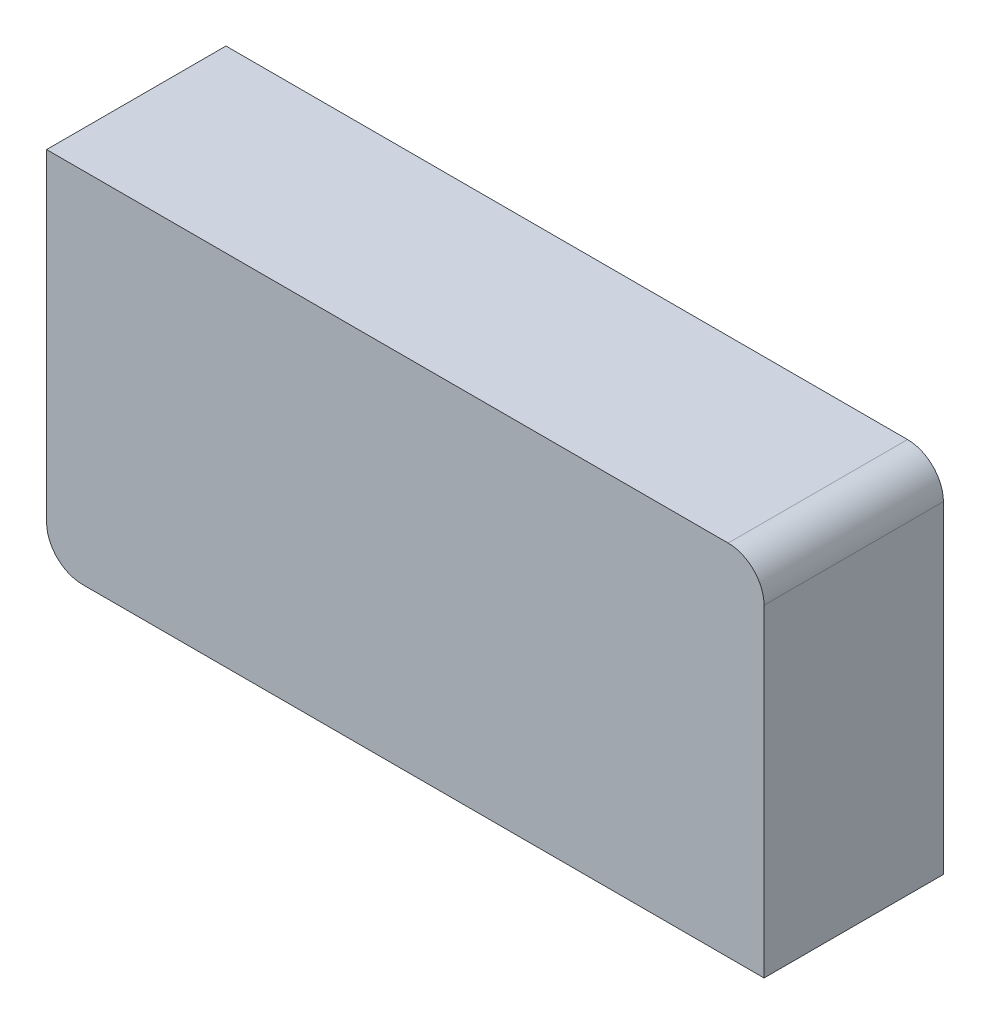
ISO-10303-21;
HEADER;
FILE_DESCRIPTION(('STEP AP214'),'2;1');
FILE_NAME('part.step','',(''),(''),'','','');
FILE_SCHEMA(('AUTOMOTIVE_DESIGN { 1 0 10303 214 1 1 1 1 }'));
ENDSEC;
DATA;
#1=APPLICATION_CONTEXT('core data for automotive mechanical design processes');
#2=APPLICATION_PROTOCOL_DEFINITION('international standard','automotive_design',2000,#1);
#3=PRODUCT_CONTEXT('',#1,'mechanical');
#4=PRODUCT('Part','Part','',(#3));
#5=PRODUCT_RELATED_PRODUCT_CATEGORY('part','',(#4));
#6=PRODUCT_DEFINITION_FORMATION('','',#4);
#7=PRODUCT_DEFINITION_CONTEXT('part definition',#1,'design');
#8=PRODUCT_DEFINITION('design','',#6,#7);
#9=PRODUCT_DEFINITION_SHAPE('','',#8);
#10=(LENGTH_UNIT() NAMED_UNIT(*) SI_UNIT(.MILLI.,.METRE.));
#11=(NAMED_UNIT(*) PLANE_ANGLE_UNIT() SI_UNIT($,.RADIAN.));
#12=(NAMED_UNIT(*) SI_UNIT($,.STERADIAN.) SOLID_ANGLE_UNIT());
#13=UNCERTAINTY_MEASURE_WITH_UNIT(LENGTH_MEASURE(1.E-05),#10,'distance_accuracy_value','');
#14=(GEOMETRIC_REPRESENTATION_CONTEXT(3) GLOBAL_UNCERTAINTY_ASSIGNED_CONTEXT((#13)) GLOBAL_UNIT_ASSIGNED_CONTEXT((#10,
#11,#12)) REPRESENTATION_CONTEXT('',''));
#15=CARTESIAN_POINT('',(0.,0.,0.));
#16=DIRECTION('',(0.,0.,1.));
#17=DIRECTION('',(1.,0.,0.));
#18=AXIS2_PLACEMENT_3D('',#15,#16,#17);
#19=CARTESIAN_POINT('',(0.,20.,10.));
#20=DIRECTION('',(1.,0.,0.));
#21=DIRECTION('',(0.,0.,-1.));
#22=AXIS2_PLACEMENT_3D('',#19,#20,#21);
#23=PLANE('',#22);
#24=DIRECTION('',(0.,-1.,0.));
#25=VECTOR('',#24,1.);
#26=CARTESIAN_POINT('',(0.,20.,0.));
#27=LINE('',#26,#25);
#28=CARTESIAN_POINT('',(0.,20.,0.));
#29=VERTEX_POINT('',#28);
#30=CARTESIAN_POINT('',(0.,2.,0.));
#31=VERTEX_POINT('',#30);
#32=EDGE_CURVE('E122',#29,#31,#27,.T.);
#33=ORIENTED_EDGE('',*,*,#32,.T.);
#34=DIRECTION('',(0.,0.,-1.));
#35=VECTOR('',#34,1.);
#36=CARTESIAN_POINT('',(0.,2.,10.));
#37=LINE('',#36,#35);
#38=CARTESIAN_POINT('',(0.,2.,10.));
#39=VERTEX_POINT('',#38);
#40=EDGE_CURVE('E11',#31,#39,#37,.F.);
#41=ORIENTED_EDGE('',*,*,#40,.T.);
#42=DIRECTION('',(0.,-1.,0.));
#43=VECTOR('',#42,1.);
#44=CARTESIAN_POINT('',(0.,20.,10.));
#45=LINE('',#44,#43);
#46=CARTESIAN_POINT('',(0.,20.,10.));
#47=VERTEX_POINT('',#46);
#48=EDGE_CURVE('E101',#47,#39,#45,.T.);
#49=ORIENTED_EDGE('',*,*,#48,.F.);
#50=DIRECTION('',(0.,0.,-1.));
#51=VECTOR('',#50,1.);
#52=CARTESIAN_POINT('',(0.,20.,10.));
#53=LINE('',#52,#51);
#54=EDGE_CURVE('E112',#47,#29,#53,.T.);
#55=ORIENTED_EDGE('',*,*,#54,.T.);
#56=EDGE_LOOP('',(#33,#41,#49,#55));
#57=FACE_BOUND('',#56,.T.);
#58=ADVANCED_FACE('F41',(#57),#23,.F.);
#59=CARTESIAN_POINT('',(0.,0.,10.));
#60=DIRECTION('',(0.,1.,0.));
#61=DIRECTION('',(0.,0.,1.));
#62=AXIS2_PLACEMENT_3D('',#59,#60,#61);
#63=PLANE('',#62);
#64=DIRECTION('',(1.,0.,0.));
#65=VECTOR('',#64,1.);
#66=CARTESIAN_POINT('',(0.,0.,10.));
#67=LINE('',#66,#65);
#68=CARTESIAN_POINT('',(2.,0.,10.));
#69=VERTEX_POINT('',#68);
#70=CARTESIAN_POINT('',(40.,0.,10.));
#71=VERTEX_POINT('',#70);
#72=EDGE_CURVE('E92',#69,#71,#67,.T.);
#73=ORIENTED_EDGE('',*,*,#72,.F.);
#74=DIRECTION('',(0.,0.,-1.));
#75=VECTOR('',#74,1.);
#76=CARTESIAN_POINT('',(2.,0.,10.));
#77=LINE('',#76,#75);
#78=CARTESIAN_POINT('',(2.,0.,0.));
#79=VERTEX_POINT('',#78);
#80=EDGE_CURVE('E49',#69,#79,#77,.T.);
#81=ORIENTED_EDGE('',*,*,#80,.T.);
#82=DIRECTION('',(1.,0.,0.));
#83=VECTOR('',#82,1.);
#84=CARTESIAN_POINT('',(0.,0.,0.));
#85=LINE('',#84,#83);
#86=CARTESIAN_POINT('',(40.,0.,0.));
#87=VERTEX_POINT('',#86);
#88=EDGE_CURVE('E107',#79,#87,#85,.T.);
#89=ORIENTED_EDGE('',*,*,#88,.T.);
#90=DIRECTION('',(0.,0.,-1.));
#91=VECTOR('',#90,1.);
#92=CARTESIAN_POINT('',(40.,0.,10.));
#93=LINE('',#92,#91);
#94=EDGE_CURVE('E104',#71,#87,#93,.T.);
#95=ORIENTED_EDGE('',*,*,#94,.F.);
#96=EDGE_LOOP('',(#73,#81,#89,#95));
#97=FACE_BOUND('',#96,.T.);
#98=ADVANCED_FACE('F105',(#97),#63,.F.);
#99=CARTESIAN_POINT('',(40.,0.,10.));
#100=DIRECTION('',(-1.,0.,0.));
#101=DIRECTION('',(0.,0.,1.));
#102=AXIS2_PLACEMENT_3D('',#99,#100,#101);
#103=PLANE('',#102);
#104=DIRECTION('',(0.,1.,0.));
#105=VECTOR('',#104,1.);
#106=CARTESIAN_POINT('',(40.,0.,0.));
#107=LINE('',#106,#105);
#108=CARTESIAN_POINT('',(40.,18.,0.));
#109=VERTEX_POINT('',#108);
#110=EDGE_CURVE('E125',#87,#109,#107,.T.);
#111=ORIENTED_EDGE('',*,*,#110,.T.);
#112=DIRECTION('',(0.,0.,-1.));
#113=VECTOR('',#112,1.);
#114=CARTESIAN_POINT('',(40.,18.,10.));
#115=LINE('',#114,#113);
#116=CARTESIAN_POINT('',(40.,18.,10.));
#117=VERTEX_POINT('',#116);
#118=EDGE_CURVE('E116',#109,#117,#115,.F.);
#119=ORIENTED_EDGE('',*,*,#118,.T.);
#120=DIRECTION('',(0.,1.,0.));
#121=VECTOR('',#120,1.);
#122=CARTESIAN_POINT('',(40.,0.,10.));
#123=LINE('',#122,#121);
#124=EDGE_CURVE('E96',#71,#117,#123,.T.);
#125=ORIENTED_EDGE('',*,*,#124,.F.);
#126=ORIENTED_EDGE('',*,*,#94,.T.);
#127=EDGE_LOOP('',(#111,#119,#125,#126));
#128=FACE_BOUND('',#127,.T.);
#129=ADVANCED_FACE('F114',(#128),#103,.F.);
#130=CARTESIAN_POINT('',(40.,20.,10.));
#131=DIRECTION('',(0.,-1.,0.));
#132=DIRECTION('',(0.,0.,-1.));
#133=AXIS2_PLACEMENT_3D('',#130,#131,#132);
#134=PLANE('',#133);
#135=DIRECTION('',(-1.,0.,0.));
#136=VECTOR('',#135,1.);
#137=CARTESIAN_POINT('',(40.,20.,10.));
#138=LINE('',#137,#136);
#139=CARTESIAN_POINT('',(38.,20.,10.));
#140=VERTEX_POINT('',#139);
#141=EDGE_CURVE('E117',#140,#47,#138,.T.);
#142=ORIENTED_EDGE('',*,*,#141,.F.);
#143=DIRECTION('',(0.,0.,-1.));
#144=VECTOR('',#143,1.);
#145=CARTESIAN_POINT('',(38.,20.,10.));
#146=LINE('',#145,#144);
#147=CARTESIAN_POINT('',(38.,20.,0.));
#148=VERTEX_POINT('',#147);
#149=EDGE_CURVE('E111',#140,#148,#146,.T.);
#150=ORIENTED_EDGE('',*,*,#149,.T.);
#151=DIRECTION('',(-1.,0.,0.));
#152=VECTOR('',#151,1.);
#153=CARTESIAN_POINT('',(40.,20.,0.));
#154=LINE('',#153,#152);
#155=EDGE_CURVE('E127',#148,#29,#154,.T.);
#156=ORIENTED_EDGE('',*,*,#155,.T.);
#157=ORIENTED_EDGE('',*,*,#54,.F.);
#158=EDGE_LOOP('',(#142,#150,#156,#157));
#159=FACE_BOUND('',#158,.T.);
#160=ADVANCED_FACE('F151',(#159),#134,.F.);
#161=CARTESIAN_POINT('',(0.,0.,10.));
#162=DIRECTION('',(0.,0.,1.));
#163=DIRECTION('',(1.,0.,0.));
#164=AXIS2_PLACEMENT_3D('',#161,#162,#163);
#165=PLANE('',#164);
#166=ORIENTED_EDGE('',*,*,#124,.T.);
#167=CARTESIAN_POINT('',(38.,18.,10.));
#168=DIRECTION('',(0.,0.,1.));
#169=DIRECTION('',(1.,0.,0.));
#170=AXIS2_PLACEMENT_3D('',#167,#168,#169);
#171=CIRCLE('',#170,2.);
#172=EDGE_CURVE('E139',#117,#140,#171,.T.);
#173=ORIENTED_EDGE('',*,*,#172,.T.);
#174=ORIENTED_EDGE('',*,*,#141,.T.);
#175=ORIENTED_EDGE('',*,*,#48,.T.);
#176=CARTESIAN_POINT('',(2.,2.,10.));
#177=DIRECTION('',(0.,0.,1.));
#178=DIRECTION('',(1.,0.,0.));
#179=AXIS2_PLACEMENT_3D('',#176,#177,#178);
#180=CIRCLE('',#179,2.);
#181=EDGE_CURVE('E56',#39,#69,#180,.T.);
#182=ORIENTED_EDGE('',*,*,#181,.T.);
#183=ORIENTED_EDGE('',*,*,#72,.T.);
#184=EDGE_LOOP('',(#166,#173,#174,#175,#182,#183));
#185=FACE_BOUND('',#184,.T.);
#186=ADVANCED_FACE('F94',(#185),#165,.T.);
#187=CARTESIAN_POINT('',(0.,0.,0.));
#188=DIRECTION('',(0.,0.,1.));
#189=DIRECTION('',(1.,0.,0.));
#190=AXIS2_PLACEMENT_3D('',#187,#188,#189);
#191=PLANE('',#190);
#192=ORIENTED_EDGE('',*,*,#155,.F.);
#193=CARTESIAN_POINT('',(38.,18.,0.));
#194=DIRECTION('',(0.,0.,1.));
#195=DIRECTION('',(1.,0.,0.));
#196=AXIS2_PLACEMENT_3D('',#193,#194,#195);
#197=CIRCLE('',#196,2.);
#198=EDGE_CURVE('E135',#148,#109,#197,.F.);
#199=ORIENTED_EDGE('',*,*,#198,.T.);
#200=ORIENTED_EDGE('',*,*,#110,.F.);
#201=ORIENTED_EDGE('',*,*,#88,.F.);
#202=CARTESIAN_POINT('',(2.,2.,0.));
#203=DIRECTION('',(0.,0.,1.));
#204=DIRECTION('',(1.,0.,0.));
#205=AXIS2_PLACEMENT_3D('',#202,#203,#204);
#206=CIRCLE('',#205,2.);
#207=EDGE_CURVE('E133',#79,#31,#206,.F.);
#208=ORIENTED_EDGE('',*,*,#207,.T.);
#209=ORIENTED_EDGE('',*,*,#32,.F.);
#210=EDGE_LOOP('',(#192,#199,#200,#201,#208,#209));
#211=FACE_BOUND('',#210,.T.);
#212=ADVANCED_FACE('F143',(#211),#191,.F.);
#213=CARTESIAN_POINT('',(38.,18.,10.));
#214=DIRECTION('',(0.,0.,-1.));
#215=DIRECTION('',(-1.,0.,0.));
#216=AXIS2_PLACEMENT_3D('',#213,#214,#215);
#217=CYLINDRICAL_SURFACE('',#216,2.);
#218=ORIENTED_EDGE('',*,*,#172,.F.);
#219=ORIENTED_EDGE('',*,*,#118,.F.);
#220=ORIENTED_EDGE('',*,*,#198,.F.);
#221=ORIENTED_EDGE('',*,*,#149,.F.);
#222=EDGE_LOOP('',(#218,#219,#220,#221));
#223=FACE_BOUND('',#222,.T.);
#224=ADVANCED_FACE('F146',(#223),#217,.T.);
#225=CARTESIAN_POINT('',(2.,2.,10.));
#226=DIRECTION('',(0.,0.,-1.));
#227=DIRECTION('',(-1.,0.,0.));
#228=AXIS2_PLACEMENT_3D('',#225,#226,#227);
#229=CYLINDRICAL_SURFACE('',#228,2.);
#230=ORIENTED_EDGE('',*,*,#181,.F.);
#231=ORIENTED_EDGE('',*,*,#40,.F.);
#232=ORIENTED_EDGE('',*,*,#207,.F.);
#233=ORIENTED_EDGE('',*,*,#80,.F.);
#234=EDGE_LOOP('',(#230,#231,#232,#233));
#235=FACE_BOUND('',#234,.T.);
#236=ADVANCED_FACE('F43',(#235),#229,.T.);
#237=CLOSED_SHELL('',(#58,#98,#129,#160,#186,#212,#224,#236));
#238=MANIFOLD_SOLID_BREP('B2',#237);
#239=ADVANCED_BREP_SHAPE_REPRESENTATION('',(#18,#238),#14);
#240=SHAPE_DEFINITION_REPRESENTATION(#9,#239);
ENDSEC;
END-ISO-10303-21;
